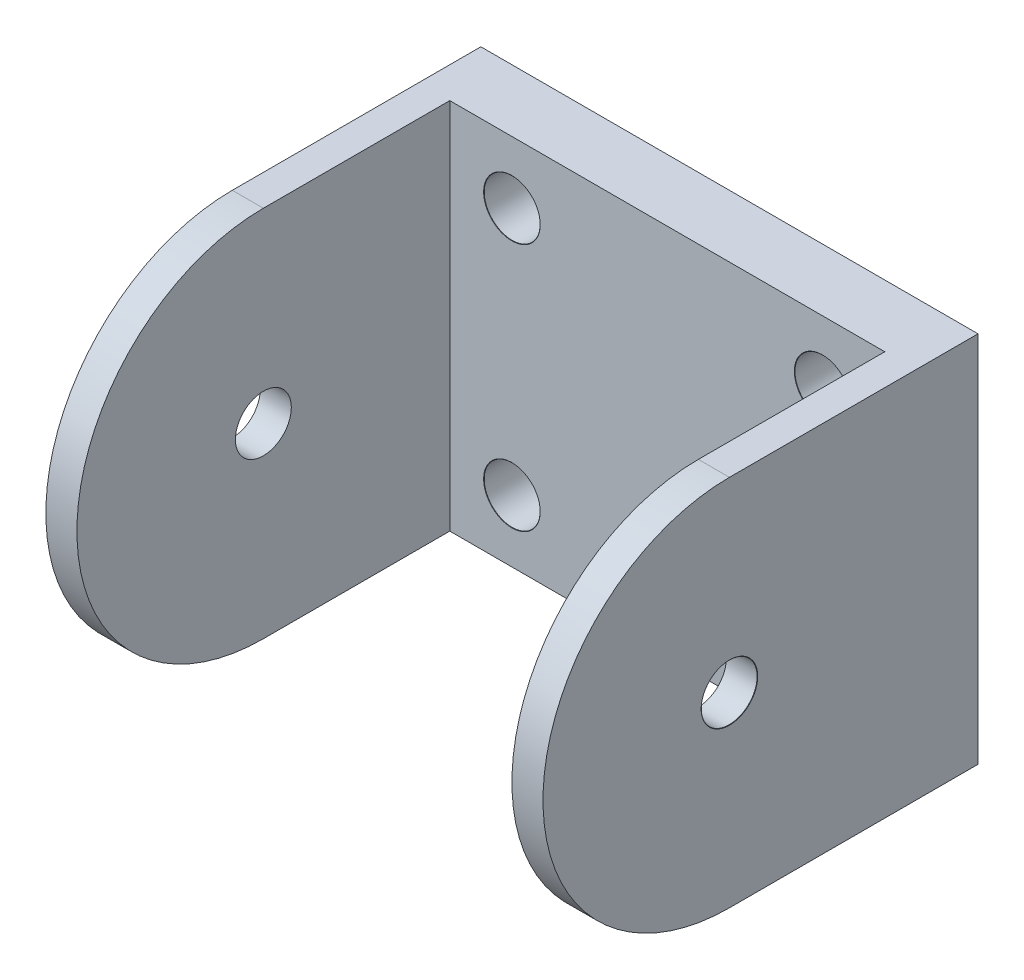
ISO-10303-21;
HEADER;
FILE_DESCRIPTION(('STEP AP214'),'2;1');
FILE_NAME('part.step','',(''),(''),'','','');
FILE_SCHEMA(('AUTOMOTIVE_DESIGN { 1 0 10303 214 1 1 1 1 }'));
ENDSEC;
DATA;
#1=APPLICATION_CONTEXT('core data for automotive mechanical design processes');
#2=APPLICATION_PROTOCOL_DEFINITION('international standard','automotive_design',2000,#1);
#3=PRODUCT_CONTEXT('',#1,'mechanical');
#4=PRODUCT('Part','Part','',(#3));
#5=PRODUCT_RELATED_PRODUCT_CATEGORY('part','',(#4));
#6=PRODUCT_DEFINITION_FORMATION('','',#4);
#7=PRODUCT_DEFINITION_CONTEXT('part definition',#1,'design');
#8=PRODUCT_DEFINITION('design','',#6,#7);
#9=PRODUCT_DEFINITION_SHAPE('','',#8);
#10=(LENGTH_UNIT() NAMED_UNIT(*) SI_UNIT(.MILLI.,.METRE.));
#11=(NAMED_UNIT(*) PLANE_ANGLE_UNIT() SI_UNIT($,.RADIAN.));
#12=(NAMED_UNIT(*) SI_UNIT($,.STERADIAN.) SOLID_ANGLE_UNIT());
#13=UNCERTAINTY_MEASURE_WITH_UNIT(LENGTH_MEASURE(1.E-05),#10,'distance_accuracy_value','');
#14=(GEOMETRIC_REPRESENTATION_CONTEXT(3) GLOBAL_UNCERTAINTY_ASSIGNED_CONTEXT((#13)) GLOBAL_UNIT_ASSIGNED_CONTEXT((#10,
#11,#12)) REPRESENTATION_CONTEXT('',''));
#15=CARTESIAN_POINT('',(0.,0.,0.));
#16=DIRECTION('',(0.,0.,1.));
#17=DIRECTION('',(1.,0.,0.));
#18=AXIS2_PLACEMENT_3D('',#15,#16,#17);
#19=CARTESIAN_POINT('',(0.,0.,5.));
#20=DIRECTION('',(0.,0.,1.));
#21=DIRECTION('',(1.,0.,0.));
#22=AXIS2_PLACEMENT_3D('',#19,#20,#21);
#23=PLANE('',#22);
#24=CARTESIAN_POINT('',(-12.5,10.,5.));
#25=DIRECTION('',(0.,0.,1.));
#26=DIRECTION('',(1.,0.,0.));
#27=AXIS2_PLACEMENT_3D('',#24,#25,#26);
#28=CIRCLE('',#27,2.275);
#29=CARTESIAN_POINT('',(-10.225,10.,5.));
#30=VERTEX_POINT('',#29);
#31=EDGE_CURVE('E388',#30,#30,#28,.T.);
#32=ORIENTED_EDGE('',*,*,#31,.F.);
#33=EDGE_LOOP('',(#32));
#34=FACE_BOUND('',#33,.T.);
#35=CARTESIAN_POINT('',(12.5,-10.,5.));
#36=DIRECTION('',(0.,0.,1.));
#37=DIRECTION('',(1.,0.,0.));
#38=AXIS2_PLACEMENT_3D('',#35,#36,#37);
#39=CIRCLE('',#38,2.275);
#40=CARTESIAN_POINT('',(14.775,-10.,5.));
#41=VERTEX_POINT('',#40);
#42=EDGE_CURVE('E408',#41,#41,#39,.T.);
#43=ORIENTED_EDGE('',*,*,#42,.F.);
#44=EDGE_LOOP('',(#43));
#45=FACE_BOUND('',#44,.T.);
#46=CARTESIAN_POINT('',(-12.5,-10.,5.));
#47=DIRECTION('',(0.,0.,1.));
#48=DIRECTION('',(1.,0.,0.));
#49=AXIS2_PLACEMENT_3D('',#46,#47,#48);
#50=CIRCLE('',#49,2.275);
#51=CARTESIAN_POINT('',(-10.225,-10.,5.));
#52=VERTEX_POINT('',#51);
#53=EDGE_CURVE('E420',#52,#52,#50,.T.);
#54=ORIENTED_EDGE('',*,*,#53,.F.);
#55=EDGE_LOOP('',(#54));
#56=FACE_BOUND('',#55,.T.);
#57=CARTESIAN_POINT('',(12.5,10.,5.));
#58=DIRECTION('',(0.,0.,1.));
#59=DIRECTION('',(1.,0.,0.));
#60=AXIS2_PLACEMENT_3D('',#57,#58,#59);
#61=CIRCLE('',#60,2.275);
#62=CARTESIAN_POINT('',(14.775,10.,5.));
#63=VERTEX_POINT('',#62);
#64=EDGE_CURVE('E432',#63,#63,#61,.T.);
#65=ORIENTED_EDGE('',*,*,#64,.F.);
#66=EDGE_LOOP('',(#65));
#67=FACE_BOUND('',#66,.T.);
#68=DIRECTION('',(-1.,0.,0.));
#69=VECTOR('',#68,1.);
#70=CARTESIAN_POINT('',(-20.,15.,5.));
#71=LINE('',#70,#69);
#72=CARTESIAN_POINT('',(17.5,15.,5.));
#73=VERTEX_POINT('',#72);
#74=CARTESIAN_POINT('',(-17.5,15.,5.));
#75=VERTEX_POINT('',#74);
#76=EDGE_CURVE('E66',#73,#75,#71,.T.);
#77=ORIENTED_EDGE('',*,*,#76,.T.);
#78=DIRECTION('',(0.,-1.,0.));
#79=VECTOR('',#78,1.);
#80=CARTESIAN_POINT('',(-17.5,15.,5.));
#81=LINE('',#80,#79);
#82=CARTESIAN_POINT('',(-17.5,-15.,5.));
#83=VERTEX_POINT('',#82);
#84=EDGE_CURVE('E61',#75,#83,#81,.T.);
#85=ORIENTED_EDGE('',*,*,#84,.T.);
#86=DIRECTION('',(1.,0.,0.));
#87=VECTOR('',#86,1.);
#88=CARTESIAN_POINT('',(-20.,-15.,5.));
#89=LINE('',#88,#87);
#90=CARTESIAN_POINT('',(17.5,-15.,5.));
#91=VERTEX_POINT('',#90);
#92=EDGE_CURVE('E174',#83,#91,#89,.T.);
#93=ORIENTED_EDGE('',*,*,#92,.T.);
#94=DIRECTION('',(0.,-1.,0.));
#95=VECTOR('',#94,1.);
#96=CARTESIAN_POINT('',(17.5,15.,5.));
#97=LINE('',#96,#95);
#98=EDGE_CURVE('E145',#73,#91,#97,.T.);
#99=ORIENTED_EDGE('',*,*,#98,.F.);
#100=EDGE_LOOP('',(#77,#85,#93,#99));
#101=FACE_BOUND('',#100,.T.);
#102=ADVANCED_FACE('F45',(#34,#45,#56,#67,#101),#23,.T.);
#103=CARTESIAN_POINT('',(20.,15.,5.));
#104=DIRECTION('',(-1.,0.,0.));
#105=DIRECTION('',(0.,0.,1.));
#106=AXIS2_PLACEMENT_3D('',#103,#104,#105);
#107=PLANE('',#106);
#108=CARTESIAN_POINT('',(20.,0.,20.));
#109=DIRECTION('',(1.,0.,0.));
#110=DIRECTION('',(0.,0.,-1.));
#111=AXIS2_PLACEMENT_3D('',#108,#109,#110);
#112=CIRCLE('',#111,2.275);
#113=CARTESIAN_POINT('',(20.,0.,17.725));
#114=VERTEX_POINT('',#113);
#115=EDGE_CURVE('E474',#114,#114,#112,.T.);
#116=ORIENTED_EDGE('',*,*,#115,.F.);
#117=EDGE_LOOP('',(#116));
#118=FACE_BOUND('',#117,.T.);
#119=DIRECTION('',(0.,1.,0.));
#120=VECTOR('',#119,1.);
#121=CARTESIAN_POINT('',(20.,15.,0.));
#122=LINE('',#121,#120);
#123=CARTESIAN_POINT('',(20.,-15.,0.));
#124=VERTEX_POINT('',#123);
#125=CARTESIAN_POINT('',(20.,15.,0.));
#126=VERTEX_POINT('',#125);
#127=EDGE_CURVE('E171',#124,#126,#122,.T.);
#128=ORIENTED_EDGE('',*,*,#127,.T.);
#129=DIRECTION('',(0.,0.,-1.));
#130=VECTOR('',#129,1.);
#131=CARTESIAN_POINT('',(20.,15.,5.));
#132=LINE('',#131,#130);
#133=CARTESIAN_POINT('',(20.,15.,20.));
#134=VERTEX_POINT('',#133);
#135=EDGE_CURVE('E11',#134,#126,#132,.T.);
#136=ORIENTED_EDGE('',*,*,#135,.F.);
#137=CARTESIAN_POINT('',(20.,0.,20.));
#138=DIRECTION('',(1.,0.,0.));
#139=DIRECTION('',(0.,0.,-1.));
#140=AXIS2_PLACEMENT_3D('',#137,#138,#139);
#141=CIRCLE('',#140,15.);
#142=CARTESIAN_POINT('',(20.,-15.,20.));
#143=VERTEX_POINT('',#142);
#144=EDGE_CURVE('E126',#134,#143,#141,.T.);
#145=ORIENTED_EDGE('',*,*,#144,.T.);
#146=DIRECTION('',(0.,0.,-1.));
#147=VECTOR('',#146,1.);
#148=CARTESIAN_POINT('',(20.,-15.,5.));
#149=LINE('',#148,#147);
#150=EDGE_CURVE('E178',#143,#124,#149,.T.);
#151=ORIENTED_EDGE('',*,*,#150,.T.);
#152=EDGE_LOOP('',(#128,#136,#145,#151));
#153=FACE_BOUND('',#152,.T.);
#154=ADVANCED_FACE('F47',(#118,#153),#107,.F.);
#155=CARTESIAN_POINT('',(-20.,15.,5.));
#156=DIRECTION('',(0.,-1.,0.));
#157=DIRECTION('',(0.,0.,-1.));
#158=AXIS2_PLACEMENT_3D('',#155,#156,#157);
#159=PLANE('',#158);
#160=DIRECTION('',(-1.,0.,0.));
#161=VECTOR('',#160,1.);
#162=CARTESIAN_POINT('',(-20.,15.,0.));
#163=LINE('',#162,#161);
#164=CARTESIAN_POINT('',(-20.,15.,0.));
#165=VERTEX_POINT('',#164);
#166=EDGE_CURVE('E182',#126,#165,#163,.T.);
#167=ORIENTED_EDGE('',*,*,#166,.T.);
#168=DIRECTION('',(0.,0.,-1.));
#169=VECTOR('',#168,1.);
#170=CARTESIAN_POINT('',(-20.,15.,5.));
#171=LINE('',#170,#169);
#172=CARTESIAN_POINT('',(-20.,15.,20.));
#173=VERTEX_POINT('',#172);
#174=EDGE_CURVE('E54',#173,#165,#171,.T.);
#175=ORIENTED_EDGE('',*,*,#174,.F.);
#176=DIRECTION('',(-1.,0.,0.));
#177=VECTOR('',#176,1.);
#178=CARTESIAN_POINT('',(-17.5,15.,20.));
#179=LINE('',#178,#177);
#180=CARTESIAN_POINT('',(-17.5,15.,20.));
#181=VERTEX_POINT('',#180);
#182=EDGE_CURVE('E119',#181,#173,#179,.T.);
#183=ORIENTED_EDGE('',*,*,#182,.F.);
#184=DIRECTION('',(0.,0.,1.));
#185=VECTOR('',#184,1.);
#186=CARTESIAN_POINT('',(-17.5,15.,5.));
#187=LINE('',#186,#185);
#188=EDGE_CURVE('E108',#75,#181,#187,.T.);
#189=ORIENTED_EDGE('',*,*,#188,.F.);
#190=ORIENTED_EDGE('',*,*,#76,.F.);
#191=DIRECTION('',(0.,0.,1.));
#192=VECTOR('',#191,1.);
#193=CARTESIAN_POINT('',(17.5,15.,5.));
#194=LINE('',#193,#192);
#195=CARTESIAN_POINT('',(17.5,15.,20.));
#196=VERTEX_POINT('',#195);
#197=EDGE_CURVE('E156',#73,#196,#194,.T.);
#198=ORIENTED_EDGE('',*,*,#197,.T.);
#199=DIRECTION('',(1.,0.,0.));
#200=VECTOR('',#199,1.);
#201=CARTESIAN_POINT('',(17.5,15.,20.));
#202=LINE('',#201,#200);
#203=EDGE_CURVE('E160',#196,#134,#202,.T.);
#204=ORIENTED_EDGE('',*,*,#203,.T.);
#205=ORIENTED_EDGE('',*,*,#135,.T.);
#206=EDGE_LOOP('',(#167,#175,#183,#189,#190,#198,#204,#205));
#207=FACE_BOUND('',#206,.T.);
#208=ADVANCED_FACE('F120',(#207),#159,.F.);
#209=CARTESIAN_POINT('',(-20.,15.,5.));
#210=DIRECTION('',(1.,0.,0.));
#211=DIRECTION('',(0.,0.,-1.));
#212=AXIS2_PLACEMENT_3D('',#209,#210,#211);
#213=PLANE('',#212);
#214=CARTESIAN_POINT('',(-20.,0.,20.));
#215=DIRECTION('',(1.,0.,0.));
#216=DIRECTION('',(0.,0.,-1.));
#217=AXIS2_PLACEMENT_3D('',#214,#215,#216);
#218=CIRCLE('',#217,2.24999999999999);
#219=CARTESIAN_POINT('',(-20.,0.,17.75));
#220=VERTEX_POINT('',#219);
#221=EDGE_CURVE('E397',#220,#220,#218,.T.);
#222=ORIENTED_EDGE('',*,*,#221,.T.);
#223=EDGE_LOOP('',(#222));
#224=FACE_BOUND('',#223,.T.);
#225=DIRECTION('',(0.,-1.,0.));
#226=VECTOR('',#225,1.);
#227=CARTESIAN_POINT('',(-20.,15.,0.));
#228=LINE('',#227,#226);
#229=CARTESIAN_POINT('',(-20.,-15.,0.));
#230=VERTEX_POINT('',#229);
#231=EDGE_CURVE('E185',#165,#230,#228,.T.);
#232=ORIENTED_EDGE('',*,*,#231,.T.);
#233=DIRECTION('',(0.,0.,-1.));
#234=VECTOR('',#233,1.);
#235=CARTESIAN_POINT('',(-20.,-15.,5.));
#236=LINE('',#235,#234);
#237=CARTESIAN_POINT('',(-20.,-15.,20.));
#238=VERTEX_POINT('',#237);
#239=EDGE_CURVE('E193',#238,#230,#236,.T.);
#240=ORIENTED_EDGE('',*,*,#239,.F.);
#241=CARTESIAN_POINT('',(-20.,0.,20.));
#242=DIRECTION('',(1.,0.,0.));
#243=DIRECTION('',(0.,0.,-1.));
#244=AXIS2_PLACEMENT_3D('',#241,#242,#243);
#245=CIRCLE('',#244,15.);
#246=EDGE_CURVE('E139',#173,#238,#245,.T.);
#247=ORIENTED_EDGE('',*,*,#246,.F.);
#248=ORIENTED_EDGE('',*,*,#174,.T.);
#249=EDGE_LOOP('',(#232,#240,#247,#248));
#250=FACE_BOUND('',#249,.T.);
#251=ADVANCED_FACE('F199',(#224,#250),#213,.F.);
#252=CARTESIAN_POINT('',(-20.,-15.,5.));
#253=DIRECTION('',(0.,1.,0.));
#254=DIRECTION('',(0.,0.,1.));
#255=AXIS2_PLACEMENT_3D('',#252,#253,#254);
#256=PLANE('',#255);
#257=DIRECTION('',(1.,0.,0.));
#258=VECTOR('',#257,1.);
#259=CARTESIAN_POINT('',(-20.,-15.,0.));
#260=LINE('',#259,#258);
#261=EDGE_CURVE('E175',#230,#124,#260,.T.);
#262=ORIENTED_EDGE('',*,*,#261,.T.);
#263=ORIENTED_EDGE('',*,*,#150,.F.);
#264=DIRECTION('',(1.,0.,0.));
#265=VECTOR('',#264,1.);
#266=CARTESIAN_POINT('',(17.5,-15.,20.));
#267=LINE('',#266,#265);
#268=CARTESIAN_POINT('',(17.5,-15.,20.));
#269=VERTEX_POINT('',#268);
#270=EDGE_CURVE('E167',#269,#143,#267,.T.);
#271=ORIENTED_EDGE('',*,*,#270,.F.);
#272=DIRECTION('',(0.,0.,1.));
#273=VECTOR('',#272,1.);
#274=CARTESIAN_POINT('',(17.5,-15.,5.));
#275=LINE('',#274,#273);
#276=EDGE_CURVE('E149',#91,#269,#275,.T.);
#277=ORIENTED_EDGE('',*,*,#276,.F.);
#278=ORIENTED_EDGE('',*,*,#92,.F.);
#279=DIRECTION('',(0.,0.,1.));
#280=VECTOR('',#279,1.);
#281=CARTESIAN_POINT('',(-17.5,-15.,5.));
#282=LINE('',#281,#280);
#283=CARTESIAN_POINT('',(-17.5,-15.,20.));
#284=VERTEX_POINT('',#283);
#285=EDGE_CURVE('E133',#83,#284,#282,.T.);
#286=ORIENTED_EDGE('',*,*,#285,.T.);
#287=DIRECTION('',(-1.,0.,0.));
#288=VECTOR('',#287,1.);
#289=CARTESIAN_POINT('',(-17.5,-15.,20.));
#290=LINE('',#289,#288);
#291=EDGE_CURVE('E127',#284,#238,#290,.T.);
#292=ORIENTED_EDGE('',*,*,#291,.T.);
#293=ORIENTED_EDGE('',*,*,#239,.T.);
#294=EDGE_LOOP('',(#262,#263,#271,#277,#278,#286,#292,#293));
#295=FACE_BOUND('',#294,.T.);
#296=ADVANCED_FACE('F205',(#295),#256,.F.);
#297=CARTESIAN_POINT('',(0.,0.,0.));
#298=DIRECTION('',(0.,0.,1.));
#299=DIRECTION('',(1.,0.,0.));
#300=AXIS2_PLACEMENT_3D('',#297,#298,#299);
#301=PLANE('',#300);
#302=CARTESIAN_POINT('',(-12.5,10.,0.));
#303=DIRECTION('',(0.,0.,1.));
#304=DIRECTION('',(1.,0.,0.));
#305=AXIS2_PLACEMENT_3D('',#302,#303,#304);
#306=CIRCLE('',#305,2.25);
#307=CARTESIAN_POINT('',(-10.25,10.,0.));
#308=VERTEX_POINT('',#307);
#309=EDGE_CURVE('E404',#308,#308,#306,.T.);
#310=ORIENTED_EDGE('',*,*,#309,.T.);
#311=EDGE_LOOP('',(#310));
#312=FACE_BOUND('',#311,.T.);
#313=CARTESIAN_POINT('',(12.5,-10.,0.));
#314=DIRECTION('',(0.,0.,1.));
#315=DIRECTION('',(1.,0.,0.));
#316=AXIS2_PLACEMENT_3D('',#313,#314,#315);
#317=CIRCLE('',#316,2.25);
#318=CARTESIAN_POINT('',(14.75,-10.,0.));
#319=VERTEX_POINT('',#318);
#320=EDGE_CURVE('E416',#319,#319,#317,.T.);
#321=ORIENTED_EDGE('',*,*,#320,.T.);
#322=EDGE_LOOP('',(#321));
#323=FACE_BOUND('',#322,.T.);
#324=CARTESIAN_POINT('',(-12.5,-10.,0.));
#325=DIRECTION('',(0.,0.,1.));
#326=DIRECTION('',(1.,0.,0.));
#327=AXIS2_PLACEMENT_3D('',#324,#325,#326);
#328=CIRCLE('',#327,2.25);
#329=CARTESIAN_POINT('',(-10.25,-10.,0.));
#330=VERTEX_POINT('',#329);
#331=EDGE_CURVE('E428',#330,#330,#328,.T.);
#332=ORIENTED_EDGE('',*,*,#331,.T.);
#333=EDGE_LOOP('',(#332));
#334=FACE_BOUND('',#333,.T.);
#335=CARTESIAN_POINT('',(12.5,10.,0.));
#336=DIRECTION('',(0.,0.,1.));
#337=DIRECTION('',(1.,0.,0.));
#338=AXIS2_PLACEMENT_3D('',#335,#336,#337);
#339=CIRCLE('',#338,2.25);
#340=CARTESIAN_POINT('',(14.75,10.,0.));
#341=VERTEX_POINT('',#340);
#342=EDGE_CURVE('E142',#341,#341,#339,.T.);
#343=ORIENTED_EDGE('',*,*,#342,.T.);
#344=EDGE_LOOP('',(#343));
#345=FACE_BOUND('',#344,.T.);
#346=ORIENTED_EDGE('',*,*,#127,.F.);
#347=ORIENTED_EDGE('',*,*,#261,.F.);
#348=ORIENTED_EDGE('',*,*,#231,.F.);
#349=ORIENTED_EDGE('',*,*,#166,.F.);
#350=EDGE_LOOP('',(#346,#347,#348,#349));
#351=FACE_BOUND('',#350,.T.);
#352=ADVANCED_FACE('F203',(#312,#323,#334,#345,#351),#301,.F.);
#353=CARTESIAN_POINT('',(17.5,0.,20.));
#354=DIRECTION('',(1.,0.,0.));
#355=DIRECTION('',(0.,0.,-1.));
#356=AXIS2_PLACEMENT_3D('',#353,#354,#355);
#357=CYLINDRICAL_SURFACE('',#356,15.);
#358=ORIENTED_EDGE('',*,*,#144,.F.);
#359=ORIENTED_EDGE('',*,*,#203,.F.);
#360=CARTESIAN_POINT('',(17.5,0.,20.));
#361=DIRECTION('',(1.,0.,0.));
#362=DIRECTION('',(0.,0.,-1.));
#363=AXIS2_PLACEMENT_3D('',#360,#361,#362);
#364=CIRCLE('',#363,15.);
#365=EDGE_CURVE('E152',#196,#269,#364,.T.);
#366=ORIENTED_EDGE('',*,*,#365,.T.);
#367=ORIENTED_EDGE('',*,*,#270,.T.);
#368=EDGE_LOOP('',(#358,#359,#366,#367));
#369=FACE_BOUND('',#368,.T.);
#370=ADVANCED_FACE('F210',(#369),#357,.T.);
#371=CARTESIAN_POINT('',(17.5,0.,20.));
#372=DIRECTION('',(1.,0.,0.));
#373=DIRECTION('',(0.,0.,-1.));
#374=AXIS2_PLACEMENT_3D('',#371,#372,#373);
#375=PLANE('',#374);
#376=CARTESIAN_POINT('',(17.5,0.,20.));
#377=DIRECTION('',(1.,0.,0.));
#378=DIRECTION('',(0.,0.,-1.));
#379=AXIS2_PLACEMENT_3D('',#376,#377,#378);
#380=CIRCLE('',#379,2.24999999999999);
#381=CARTESIAN_POINT('',(17.5,0.,17.75));
#382=VERTEX_POINT('',#381);
#383=EDGE_CURVE('E385',#382,#382,#380,.T.);
#384=ORIENTED_EDGE('',*,*,#383,.T.);
#385=EDGE_LOOP('',(#384));
#386=FACE_BOUND('',#385,.T.);
#387=ORIENTED_EDGE('',*,*,#98,.T.);
#388=ORIENTED_EDGE('',*,*,#276,.T.);
#389=ORIENTED_EDGE('',*,*,#365,.F.);
#390=ORIENTED_EDGE('',*,*,#197,.F.);
#391=EDGE_LOOP('',(#387,#388,#389,#390));
#392=FACE_BOUND('',#391,.T.);
#393=ADVANCED_FACE('F215',(#386,#392),#375,.F.);
#394=CARTESIAN_POINT('',(-17.5,0.,20.));
#395=DIRECTION('',(-1.,0.,0.));
#396=DIRECTION('',(0.,0.,1.));
#397=AXIS2_PLACEMENT_3D('',#394,#395,#396);
#398=CYLINDRICAL_SURFACE('',#397,15.);
#399=ORIENTED_EDGE('',*,*,#246,.T.);
#400=ORIENTED_EDGE('',*,*,#291,.F.);
#401=CARTESIAN_POINT('',(-17.5,0.,20.));
#402=DIRECTION('',(1.,0.,0.));
#403=DIRECTION('',(0.,0.,-1.));
#404=AXIS2_PLACEMENT_3D('',#401,#402,#403);
#405=CIRCLE('',#404,15.);
#406=EDGE_CURVE('E113',#181,#284,#405,.T.);
#407=ORIENTED_EDGE('',*,*,#406,.F.);
#408=ORIENTED_EDGE('',*,*,#182,.T.);
#409=EDGE_LOOP('',(#399,#400,#407,#408));
#410=FACE_BOUND('',#409,.T.);
#411=ADVANCED_FACE('F129',(#410),#398,.T.);
#412=CARTESIAN_POINT('',(-17.5,0.,20.));
#413=DIRECTION('',(-1.,0.,0.));
#414=DIRECTION('',(0.,0.,-1.));
#415=AXIS2_PLACEMENT_3D('',#412,#413,#414);
#416=PLANE('',#415);
#417=CARTESIAN_POINT('',(-17.5,0.,20.));
#418=DIRECTION('',(-1.,0.,0.));
#419=DIRECTION('',(0.,0.,1.));
#420=AXIS2_PLACEMENT_3D('',#417,#418,#419);
#421=CIRCLE('',#420,2.24999999999999);
#422=CARTESIAN_POINT('',(-17.5,0.,22.25));
#423=VERTEX_POINT('',#422);
#424=EDGE_CURVE('E389',#423,#423,#421,.T.);
#425=ORIENTED_EDGE('',*,*,#424,.T.);
#426=EDGE_LOOP('',(#425));
#427=FACE_BOUND('',#426,.T.);
#428=ORIENTED_EDGE('',*,*,#84,.F.);
#429=ORIENTED_EDGE('',*,*,#188,.T.);
#430=ORIENTED_EDGE('',*,*,#406,.T.);
#431=ORIENTED_EDGE('',*,*,#285,.F.);
#432=EDGE_LOOP('',(#428,#429,#430,#431));
#433=FACE_BOUND('',#432,.T.);
#434=ADVANCED_FACE('F110',(#427,#433),#416,.F.);
#435=CARTESIAN_POINT('',(12.5,10.,5.));
#436=DIRECTION('',(0.,0.,1.));
#437=DIRECTION('',(1.,0.,0.));
#438=AXIS2_PLACEMENT_3D('',#435,#436,#437);
#439=CYLINDRICAL_SURFACE('',#438,2.25);
#440=ORIENTED_EDGE('',*,*,#342,.F.);
#441=EDGE_LOOP('',(#440));
#442=FACE_BOUND('',#441,.T.);
#443=CARTESIAN_POINT('',(12.5,10.,4.97902250922057));
#444=DIRECTION('',(0.,0.,1.));
#445=DIRECTION('',(1.,0.,0.));
#446=AXIS2_PLACEMENT_3D('',#443,#444,#445);
#447=CIRCLE('',#446,2.25);
#448=CARTESIAN_POINT('',(14.75,10.,4.97902250922057));
#449=VERTEX_POINT('',#448);
#450=EDGE_CURVE('E436',#449,#449,#447,.T.);
#451=ORIENTED_EDGE('',*,*,#450,.T.);
#452=EDGE_LOOP('',(#451));
#453=FACE_BOUND('',#452,.T.);
#454=ADVANCED_FACE('F265',(#442,#453),#439,.F.);
#455=CARTESIAN_POINT('',(12.5,10.,5.));
#456=DIRECTION('',(0.,0.,1.));
#457=DIRECTION('',(1.,0.,0.));
#458=AXIS2_PLACEMENT_3D('',#455,#456,#457);
#459=CONICAL_SURFACE('',#458,2.275,0.872664625997165);
#460=ORIENTED_EDGE('',*,*,#450,.F.);
#461=EDGE_LOOP('',(#460));
#462=FACE_BOUND('',#461,.T.);
#463=ORIENTED_EDGE('',*,*,#64,.T.);
#464=EDGE_LOOP('',(#463));
#465=FACE_BOUND('',#464,.T.);
#466=ADVANCED_FACE('F277',(#462,#465),#459,.F.);
#467=CARTESIAN_POINT('',(-12.5,-10.,5.));
#468=DIRECTION('',(0.,0.,1.));
#469=DIRECTION('',(1.,0.,0.));
#470=AXIS2_PLACEMENT_3D('',#467,#468,#469);
#471=CYLINDRICAL_SURFACE('',#470,2.25);
#472=ORIENTED_EDGE('',*,*,#331,.F.);
#473=EDGE_LOOP('',(#472));
#474=FACE_BOUND('',#473,.T.);
#475=CARTESIAN_POINT('',(-12.5,-10.,4.97902250922057));
#476=DIRECTION('',(0.,0.,1.));
#477=DIRECTION('',(1.,0.,0.));
#478=AXIS2_PLACEMENT_3D('',#475,#476,#477);
#479=CIRCLE('',#478,2.25);
#480=CARTESIAN_POINT('',(-10.25,-10.,4.97902250922057));
#481=VERTEX_POINT('',#480);
#482=EDGE_CURVE('E424',#481,#481,#479,.T.);
#483=ORIENTED_EDGE('',*,*,#482,.T.);
#484=EDGE_LOOP('',(#483));
#485=FACE_BOUND('',#484,.T.);
#486=ADVANCED_FACE('F287',(#474,#485),#471,.F.);
#487=CARTESIAN_POINT('',(-12.5,-10.,5.));
#488=DIRECTION('',(0.,0.,1.));
#489=DIRECTION('',(1.,0.,0.));
#490=AXIS2_PLACEMENT_3D('',#487,#488,#489);
#491=CONICAL_SURFACE('',#490,2.275,0.872664625997165);
#492=ORIENTED_EDGE('',*,*,#482,.F.);
#493=EDGE_LOOP('',(#492));
#494=FACE_BOUND('',#493,.T.);
#495=ORIENTED_EDGE('',*,*,#53,.T.);
#496=EDGE_LOOP('',(#495));
#497=FACE_BOUND('',#496,.T.);
#498=ADVANCED_FACE('F297',(#494,#497),#491,.F.);
#499=CARTESIAN_POINT('',(12.5,-10.,5.));
#500=DIRECTION('',(0.,0.,1.));
#501=DIRECTION('',(1.,0.,0.));
#502=AXIS2_PLACEMENT_3D('',#499,#500,#501);
#503=CYLINDRICAL_SURFACE('',#502,2.25);
#504=ORIENTED_EDGE('',*,*,#320,.F.);
#505=EDGE_LOOP('',(#504));
#506=FACE_BOUND('',#505,.T.);
#507=CARTESIAN_POINT('',(12.5,-10.,4.97902250922057));
#508=DIRECTION('',(0.,0.,1.));
#509=DIRECTION('',(1.,0.,0.));
#510=AXIS2_PLACEMENT_3D('',#507,#508,#509);
#511=CIRCLE('',#510,2.25);
#512=CARTESIAN_POINT('',(14.75,-10.,4.97902250922057));
#513=VERTEX_POINT('',#512);
#514=EDGE_CURVE('E412',#513,#513,#511,.T.);
#515=ORIENTED_EDGE('',*,*,#514,.T.);
#516=EDGE_LOOP('',(#515));
#517=FACE_BOUND('',#516,.T.);
#518=ADVANCED_FACE('F307',(#506,#517),#503,.F.);
#519=CARTESIAN_POINT('',(12.5,-10.,5.));
#520=DIRECTION('',(0.,0.,1.));
#521=DIRECTION('',(1.,0.,0.));
#522=AXIS2_PLACEMENT_3D('',#519,#520,#521);
#523=CONICAL_SURFACE('',#522,2.275,0.872664625997165);
#524=ORIENTED_EDGE('',*,*,#514,.F.);
#525=EDGE_LOOP('',(#524));
#526=FACE_BOUND('',#525,.T.);
#527=ORIENTED_EDGE('',*,*,#42,.T.);
#528=EDGE_LOOP('',(#527));
#529=FACE_BOUND('',#528,.T.);
#530=ADVANCED_FACE('F317',(#526,#529),#523,.F.);
#531=CARTESIAN_POINT('',(-12.5,10.,5.));
#532=DIRECTION('',(0.,0.,1.));
#533=DIRECTION('',(1.,0.,0.));
#534=AXIS2_PLACEMENT_3D('',#531,#532,#533);
#535=CYLINDRICAL_SURFACE('',#534,2.25);
#536=ORIENTED_EDGE('',*,*,#309,.F.);
#537=EDGE_LOOP('',(#536));
#538=FACE_BOUND('',#537,.T.);
#539=CARTESIAN_POINT('',(-12.5,10.,4.97902250922057));
#540=DIRECTION('',(0.,0.,1.));
#541=DIRECTION('',(1.,0.,0.));
#542=AXIS2_PLACEMENT_3D('',#539,#540,#541);
#543=CIRCLE('',#542,2.25);
#544=CARTESIAN_POINT('',(-10.25,10.,4.97902250922057));
#545=VERTEX_POINT('',#544);
#546=EDGE_CURVE('E394',#545,#545,#543,.T.);
#547=ORIENTED_EDGE('',*,*,#546,.T.);
#548=EDGE_LOOP('',(#547));
#549=FACE_BOUND('',#548,.T.);
#550=ADVANCED_FACE('F327',(#538,#549),#535,.F.);
#551=CARTESIAN_POINT('',(-12.5,10.,5.));
#552=DIRECTION('',(0.,0.,1.));
#553=DIRECTION('',(1.,0.,0.));
#554=AXIS2_PLACEMENT_3D('',#551,#552,#553);
#555=CONICAL_SURFACE('',#554,2.275,0.872664625997199);
#556=ORIENTED_EDGE('',*,*,#546,.F.);
#557=EDGE_LOOP('',(#556));
#558=FACE_BOUND('',#557,.T.);
#559=ORIENTED_EDGE('',*,*,#31,.T.);
#560=EDGE_LOOP('',(#559));
#561=FACE_BOUND('',#560,.T.);
#562=ADVANCED_FACE('F337',(#558,#561),#555,.F.);
#563=CARTESIAN_POINT('',(20.,0.,20.));
#564=DIRECTION('',(1.,0.,0.));
#565=DIRECTION('',(0.,0.,-1.));
#566=AXIS2_PLACEMENT_3D('',#563,#564,#565);
#567=CYLINDRICAL_SURFACE('',#566,2.24999999999999);
#568=ORIENTED_EDGE('',*,*,#221,.F.);
#569=EDGE_LOOP('',(#568));
#570=FACE_BOUND('',#569,.T.);
#571=ORIENTED_EDGE('',*,*,#424,.F.);
#572=EDGE_LOOP('',(#571));
#573=FACE_BOUND('',#572,.T.);
#574=ADVANCED_FACE('F347',(#570,#573),#567,.F.);
#575=CARTESIAN_POINT('',(19.9790225092206,0.,20.));
#576=DIRECTION('',(1.,0.,0.));
#577=DIRECTION('',(0.,0.,-1.));
#578=AXIS2_PLACEMENT_3D('',#575,#576,#577);
#579=CIRCLE('',#578,2.25);
#580=CARTESIAN_POINT('',(19.9790225092206,0.,17.75));
#581=VERTEX_POINT('',#580);
#582=EDGE_CURVE('E470',#581,#581,#579,.T.);
#583=ORIENTED_EDGE('',*,*,#582,.T.);
#584=EDGE_LOOP('',(#583));
#585=FACE_BOUND('',#584,.T.);
#586=ORIENTED_EDGE('',*,*,#383,.F.);
#587=EDGE_LOOP('',(#586));
#588=FACE_BOUND('',#587,.T.);
#589=ADVANCED_FACE('F356',(#585,#588),#567,.F.);
#590=CARTESIAN_POINT('',(20.,0.,20.));
#591=DIRECTION('',(1.,0.,0.));
#592=DIRECTION('',(0.,0.,-1.));
#593=AXIS2_PLACEMENT_3D('',#590,#591,#592);
#594=CONICAL_SURFACE('',#593,2.275,0.872664625997317);
#595=ORIENTED_EDGE('',*,*,#582,.F.);
#596=EDGE_LOOP('',(#595));
#597=FACE_BOUND('',#596,.T.);
#598=ORIENTED_EDGE('',*,*,#115,.T.);
#599=EDGE_LOOP('',(#598));
#600=FACE_BOUND('',#599,.T.);
#601=ADVANCED_FACE('F366',(#597,#600),#594,.F.);
#602=CLOSED_SHELL('',(#102,#154,#208,#251,#296,#352,#370,#393,#411,#434,#454,#466,#486,#498,
#518,#530,#550,#562,#574,#589,#601));
#603=MANIFOLD_SOLID_BREP('B2',#602);
#604=ADVANCED_BREP_SHAPE_REPRESENTATION('',(#18,#603),#14);
#605=SHAPE_DEFINITION_REPRESENTATION(#9,#604);
ENDSEC;
END-ISO-10303-21;
